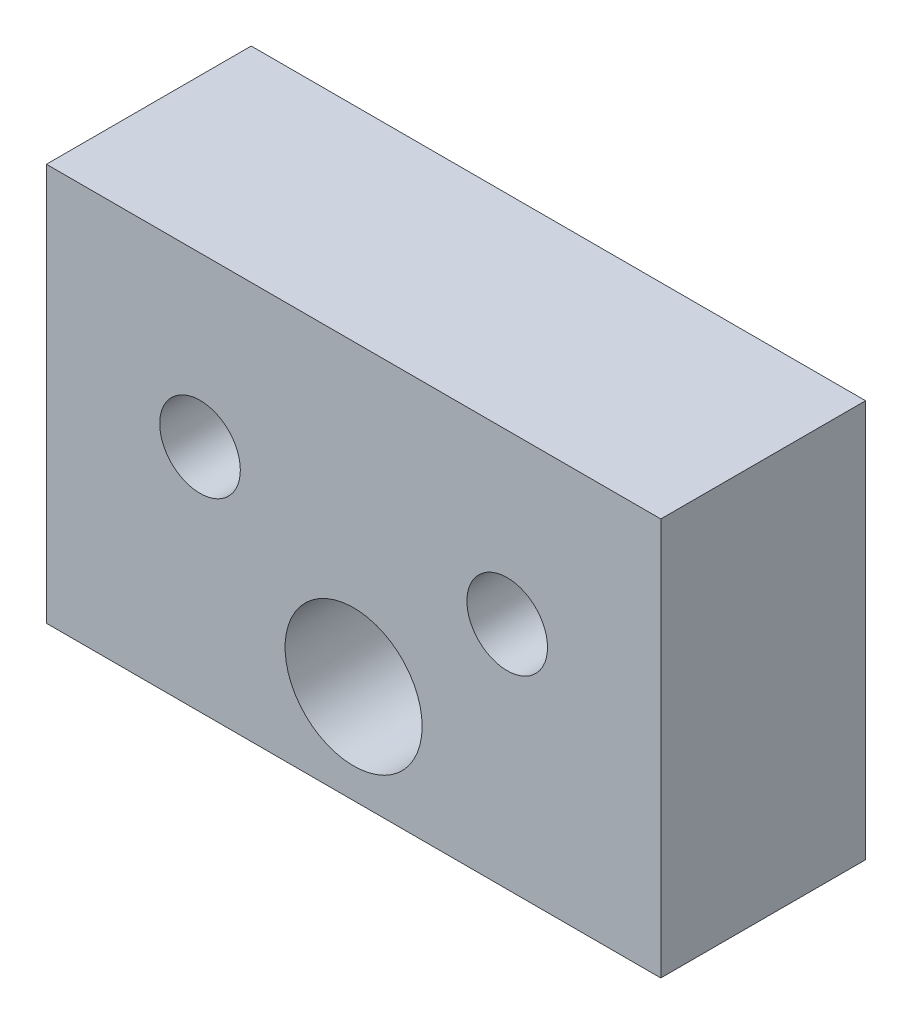
ISO-10303-21;
HEADER;
FILE_DESCRIPTION(('STEP AP214'),'2;1');
FILE_NAME('part.step','',(''),(''),'','','');
FILE_SCHEMA(('AUTOMOTIVE_DESIGN { 1 0 10303 214 1 1 1 1 }'));
ENDSEC;
DATA;
#1=APPLICATION_CONTEXT('core data for automotive mechanical design processes');
#2=APPLICATION_PROTOCOL_DEFINITION('international standard','automotive_design',2000,#1);
#3=PRODUCT_CONTEXT('',#1,'mechanical');
#4=PRODUCT('Part','Part','',(#3));
#5=PRODUCT_RELATED_PRODUCT_CATEGORY('part','',(#4));
#6=PRODUCT_DEFINITION_FORMATION('','',#4);
#7=PRODUCT_DEFINITION_CONTEXT('part definition',#1,'design');
#8=PRODUCT_DEFINITION('design','',#6,#7);
#9=PRODUCT_DEFINITION_SHAPE('','',#8);
#10=(LENGTH_UNIT() NAMED_UNIT(*) SI_UNIT(.MILLI.,.METRE.));
#11=(NAMED_UNIT(*) PLANE_ANGLE_UNIT() SI_UNIT($,.RADIAN.));
#12=(NAMED_UNIT(*) SI_UNIT($,.STERADIAN.) SOLID_ANGLE_UNIT());
#13=UNCERTAINTY_MEASURE_WITH_UNIT(LENGTH_MEASURE(1.E-05),#10,'distance_accuracy_value','');
#14=(GEOMETRIC_REPRESENTATION_CONTEXT(3) GLOBAL_UNCERTAINTY_ASSIGNED_CONTEXT((#13)) GLOBAL_UNIT_ASSIGNED_CONTEXT((#10,
#11,#12)) REPRESENTATION_CONTEXT('',''));
#15=CARTESIAN_POINT('',(0.,0.,0.));
#16=DIRECTION('',(0.,0.,1.));
#17=DIRECTION('',(1.,0.,0.));
#18=AXIS2_PLACEMENT_3D('',#15,#16,#17);
#19=CARTESIAN_POINT('',(0.,37.084,12.7));
#20=DIRECTION('',(0.,1.,0.));
#21=DIRECTION('',(0.,0.,1.));
#22=AXIS2_PLACEMENT_3D('',#19,#20,#21);
#23=PLANE('',#22);
#24=DIRECTION('',(1.,0.,0.));
#25=VECTOR('',#24,1.);
#26=CARTESIAN_POINT('',(0.,37.084,-12.7));
#27=LINE('',#26,#25);
#28=CARTESIAN_POINT('',(-38.1,37.084,-12.7));
#29=VERTEX_POINT('',#28);
#30=CARTESIAN_POINT('',(38.1,37.084,-12.7));
#31=VERTEX_POINT('',#30);
#32=EDGE_CURVE('E105',#29,#31,#27,.T.);
#33=ORIENTED_EDGE('',*,*,#32,.F.);
#34=DIRECTION('',(0.,0.,-1.));
#35=VECTOR('',#34,1.);
#36=CARTESIAN_POINT('',(-38.1,37.084,12.7));
#37=LINE('',#36,#35);
#38=CARTESIAN_POINT('',(-38.1,37.084,12.7));
#39=VERTEX_POINT('',#38);
#40=EDGE_CURVE('E11',#39,#29,#37,.T.);
#41=ORIENTED_EDGE('',*,*,#40,.F.);
#42=DIRECTION('',(1.,0.,0.));
#43=VECTOR('',#42,1.);
#44=CARTESIAN_POINT('',(0.,37.084,12.7));
#45=LINE('',#44,#43);
#46=CARTESIAN_POINT('',(38.1,37.084,12.7));
#47=VERTEX_POINT('',#46);
#48=EDGE_CURVE('E91',#39,#47,#45,.T.);
#49=ORIENTED_EDGE('',*,*,#48,.T.);
#50=DIRECTION('',(0.,0.,-1.));
#51=VECTOR('',#50,1.);
#52=CARTESIAN_POINT('',(38.1,37.084,12.7));
#53=LINE('',#52,#51);
#54=EDGE_CURVE('E73',#47,#31,#53,.T.);
#55=ORIENTED_EDGE('',*,*,#54,.T.);
#56=EDGE_LOOP('',(#33,#41,#49,#55));
#57=FACE_BOUND('',#56,.T.);
#58=ADVANCED_FACE('F34',(#57),#23,.T.);
#59=CARTESIAN_POINT('',(-38.1,0.,12.7));
#60=DIRECTION('',(1.,0.,0.));
#61=DIRECTION('',(0.,0.,-1.));
#62=AXIS2_PLACEMENT_3D('',#59,#60,#61);
#63=PLANE('',#62);
#64=DIRECTION('',(0.,-1.,0.));
#65=VECTOR('',#64,1.);
#66=CARTESIAN_POINT('',(-38.1,0.,-12.7));
#67=LINE('',#66,#65);
#68=CARTESIAN_POINT('',(-38.1,-12.224,-12.7));
#69=VERTEX_POINT('',#68);
#70=EDGE_CURVE('E96',#29,#69,#67,.T.);
#71=ORIENTED_EDGE('',*,*,#70,.T.);
#72=DIRECTION('',(0.,0.,-1.));
#73=VECTOR('',#72,1.);
#74=CARTESIAN_POINT('',(-38.1,-12.224,12.7));
#75=LINE('',#74,#73);
#76=CARTESIAN_POINT('',(-38.1,-12.224,12.7));
#77=VERTEX_POINT('',#76);
#78=EDGE_CURVE('E43',#77,#69,#75,.T.);
#79=ORIENTED_EDGE('',*,*,#78,.F.);
#80=DIRECTION('',(0.,-1.,0.));
#81=VECTOR('',#80,1.);
#82=CARTESIAN_POINT('',(-38.1,0.,12.7));
#83=LINE('',#82,#81);
#84=EDGE_CURVE('E88',#39,#77,#83,.T.);
#85=ORIENTED_EDGE('',*,*,#84,.F.);
#86=ORIENTED_EDGE('',*,*,#40,.T.);
#87=EDGE_LOOP('',(#71,#79,#85,#86));
#88=FACE_BOUND('',#87,.T.);
#89=ADVANCED_FACE('F94',(#88),#63,.F.);
#90=CARTESIAN_POINT('',(0.,-12.224,12.7));
#91=DIRECTION('',(0.,1.,0.));
#92=DIRECTION('',(0.,0.,1.));
#93=AXIS2_PLACEMENT_3D('',#90,#91,#92);
#94=PLANE('',#93);
#95=DIRECTION('',(1.,0.,0.));
#96=VECTOR('',#95,1.);
#97=CARTESIAN_POINT('',(0.,-12.224,-12.7));
#98=LINE('',#97,#96);
#99=CARTESIAN_POINT('',(38.1,-12.224,-12.7));
#100=VERTEX_POINT('',#99);
#101=EDGE_CURVE('E102',#69,#100,#98,.T.);
#102=ORIENTED_EDGE('',*,*,#101,.T.);
#103=DIRECTION('',(0.,0.,-1.));
#104=VECTOR('',#103,1.);
#105=CARTESIAN_POINT('',(38.1,-12.224,12.7));
#106=LINE('',#105,#104);
#107=CARTESIAN_POINT('',(38.1,-12.224,12.7));
#108=VERTEX_POINT('',#107);
#109=EDGE_CURVE('E87',#108,#100,#106,.T.);
#110=ORIENTED_EDGE('',*,*,#109,.F.);
#111=DIRECTION('',(1.,0.,0.));
#112=VECTOR('',#111,1.);
#113=CARTESIAN_POINT('',(0.,-12.224,12.7));
#114=LINE('',#113,#112);
#115=EDGE_CURVE('E81',#77,#108,#114,.T.);
#116=ORIENTED_EDGE('',*,*,#115,.F.);
#117=ORIENTED_EDGE('',*,*,#78,.T.);
#118=EDGE_LOOP('',(#102,#110,#116,#117));
#119=FACE_BOUND('',#118,.T.);
#120=ADVANCED_FACE('F84',(#119),#94,.F.);
#121=CARTESIAN_POINT('',(0.,0.,12.7));
#122=DIRECTION('',(0.,0.,-1.));
#123=DIRECTION('',(-1.,0.,0.));
#124=AXIS2_PLACEMENT_3D('',#121,#122,#123);
#125=CYLINDRICAL_SURFACE('',#124,8.5);
#126=CARTESIAN_POINT('',(0.,0.,12.7));
#127=DIRECTION('',(0.,0.,1.));
#128=DIRECTION('',(1.,0.,0.));
#129=AXIS2_PLACEMENT_3D('',#126,#127,#128);
#130=CIRCLE('',#129,8.5);
#131=CARTESIAN_POINT('',(8.5,0.,12.7));
#132=VERTEX_POINT('',#131);
#133=EDGE_CURVE('E118',#132,#132,#130,.T.);
#134=ORIENTED_EDGE('',*,*,#133,.T.);
#135=EDGE_LOOP('',(#134));
#136=FACE_BOUND('',#135,.T.);
#137=CARTESIAN_POINT('',(0.,0.,-12.7));
#138=DIRECTION('',(0.,0.,1.));
#139=DIRECTION('',(1.,0.,0.));
#140=AXIS2_PLACEMENT_3D('',#137,#138,#139);
#141=CIRCLE('',#140,8.5);
#142=CARTESIAN_POINT('',(8.5,0.,-12.7));
#143=VERTEX_POINT('',#142);
#144=EDGE_CURVE('E107',#143,#143,#141,.T.);
#145=ORIENTED_EDGE('',*,*,#144,.F.);
#146=EDGE_LOOP('',(#145));
#147=FACE_BOUND('',#146,.T.);
#148=ADVANCED_FACE('F138',(#136,#147),#125,.F.);
#149=CARTESIAN_POINT('',(19.05,16.256,12.7));
#150=DIRECTION('',(0.,0.,-1.));
#151=DIRECTION('',(-1.,0.,0.));
#152=AXIS2_PLACEMENT_3D('',#149,#150,#151);
#153=CYLINDRICAL_SURFACE('',#152,5.);
#154=CARTESIAN_POINT('',(19.05,16.256,12.7));
#155=DIRECTION('',(0.,0.,1.));
#156=DIRECTION('',(1.,0.,0.));
#157=AXIS2_PLACEMENT_3D('',#154,#155,#156);
#158=CIRCLE('',#157,5.);
#159=CARTESIAN_POINT('',(24.05,16.256,12.7));
#160=VERTEX_POINT('',#159);
#161=EDGE_CURVE('E121',#160,#160,#158,.T.);
#162=ORIENTED_EDGE('',*,*,#161,.T.);
#163=EDGE_LOOP('',(#162));
#164=FACE_BOUND('',#163,.T.);
#165=CARTESIAN_POINT('',(19.05,16.256,-12.7));
#166=DIRECTION('',(0.,0.,1.));
#167=DIRECTION('',(1.,0.,0.));
#168=AXIS2_PLACEMENT_3D('',#165,#166,#167);
#169=CIRCLE('',#168,5.);
#170=CARTESIAN_POINT('',(24.05,16.256,-12.7));
#171=VERTEX_POINT('',#170);
#172=EDGE_CURVE('E110',#171,#171,#169,.T.);
#173=ORIENTED_EDGE('',*,*,#172,.F.);
#174=EDGE_LOOP('',(#173));
#175=FACE_BOUND('',#174,.T.);
#176=ADVANCED_FACE('F141',(#164,#175),#153,.F.);
#177=CARTESIAN_POINT('',(-19.05,16.256,12.7));
#178=DIRECTION('',(0.,0.,-1.));
#179=DIRECTION('',(-1.,0.,0.));
#180=AXIS2_PLACEMENT_3D('',#177,#178,#179);
#181=CYLINDRICAL_SURFACE('',#180,5.);
#182=CARTESIAN_POINT('',(-19.05,16.256,12.7));
#183=DIRECTION('',(0.,0.,1.));
#184=DIRECTION('',(1.,0.,0.));
#185=AXIS2_PLACEMENT_3D('',#182,#183,#184);
#186=CIRCLE('',#185,5.);
#187=CARTESIAN_POINT('',(-14.05,16.256,12.7));
#188=VERTEX_POINT('',#187);
#189=EDGE_CURVE('E101',#188,#188,#186,.T.);
#190=ORIENTED_EDGE('',*,*,#189,.T.);
#191=EDGE_LOOP('',(#190));
#192=FACE_BOUND('',#191,.T.);
#193=CARTESIAN_POINT('',(-19.05,16.256,-12.7));
#194=DIRECTION('',(0.,0.,1.));
#195=DIRECTION('',(1.,0.,0.));
#196=AXIS2_PLACEMENT_3D('',#193,#194,#195);
#197=CIRCLE('',#196,5.);
#198=CARTESIAN_POINT('',(-14.05,16.256,-12.7));
#199=VERTEX_POINT('',#198);
#200=EDGE_CURVE('E113',#199,#199,#197,.T.);
#201=ORIENTED_EDGE('',*,*,#200,.F.);
#202=EDGE_LOOP('',(#201));
#203=FACE_BOUND('',#202,.T.);
#204=ADVANCED_FACE('F36',(#192,#203),#181,.F.);
#205=CARTESIAN_POINT('',(38.1,0.,12.7));
#206=DIRECTION('',(-1.,0.,0.));
#207=DIRECTION('',(0.,0.,1.));
#208=AXIS2_PLACEMENT_3D('',#205,#206,#207);
#209=PLANE('',#208);
#210=DIRECTION('',(0.,1.,0.));
#211=VECTOR('',#210,1.);
#212=CARTESIAN_POINT('',(38.1,0.,-12.7));
#213=LINE('',#212,#211);
#214=EDGE_CURVE('E66',#100,#31,#213,.T.);
#215=ORIENTED_EDGE('',*,*,#214,.T.);
#216=ORIENTED_EDGE('',*,*,#54,.F.);
#217=DIRECTION('',(0.,1.,0.));
#218=VECTOR('',#217,1.);
#219=CARTESIAN_POINT('',(38.1,0.,12.7));
#220=LINE('',#219,#218);
#221=EDGE_CURVE('E51',#108,#47,#220,.T.);
#222=ORIENTED_EDGE('',*,*,#221,.F.);
#223=ORIENTED_EDGE('',*,*,#109,.T.);
#224=EDGE_LOOP('',(#215,#216,#222,#223));
#225=FACE_BOUND('',#224,.T.);
#226=ADVANCED_FACE('F132',(#225),#209,.F.);
#227=CARTESIAN_POINT('',(0.,0.,12.7));
#228=DIRECTION('',(0.,0.,1.));
#229=DIRECTION('',(1.,0.,0.));
#230=AXIS2_PLACEMENT_3D('',#227,#228,#229);
#231=PLANE('',#230);
#232=ORIENTED_EDGE('',*,*,#189,.F.);
#233=EDGE_LOOP('',(#232));
#234=FACE_BOUND('',#233,.T.);
#235=ORIENTED_EDGE('',*,*,#161,.F.);
#236=EDGE_LOOP('',(#235));
#237=FACE_BOUND('',#236,.T.);
#238=ORIENTED_EDGE('',*,*,#133,.F.);
#239=EDGE_LOOP('',(#238));
#240=FACE_BOUND('',#239,.T.);
#241=ORIENTED_EDGE('',*,*,#48,.F.);
#242=ORIENTED_EDGE('',*,*,#84,.T.);
#243=ORIENTED_EDGE('',*,*,#115,.T.);
#244=ORIENTED_EDGE('',*,*,#221,.T.);
#245=EDGE_LOOP('',(#241,#242,#243,#244));
#246=FACE_BOUND('',#245,.T.);
#247=ADVANCED_FACE('F90',(#234,#237,#240,#246),#231,.T.);
#248=CARTESIAN_POINT('',(0.,0.,-12.7));
#249=DIRECTION('',(0.,0.,1.));
#250=DIRECTION('',(1.,0.,0.));
#251=AXIS2_PLACEMENT_3D('',#248,#249,#250);
#252=PLANE('',#251);
#253=ORIENTED_EDGE('',*,*,#200,.T.);
#254=EDGE_LOOP('',(#253));
#255=FACE_BOUND('',#254,.T.);
#256=ORIENTED_EDGE('',*,*,#172,.T.);
#257=EDGE_LOOP('',(#256));
#258=FACE_BOUND('',#257,.T.);
#259=ORIENTED_EDGE('',*,*,#144,.T.);
#260=EDGE_LOOP('',(#259));
#261=FACE_BOUND('',#260,.T.);
#262=ORIENTED_EDGE('',*,*,#32,.T.);
#263=ORIENTED_EDGE('',*,*,#214,.F.);
#264=ORIENTED_EDGE('',*,*,#101,.F.);
#265=ORIENTED_EDGE('',*,*,#70,.F.);
#266=EDGE_LOOP('',(#262,#263,#264,#265));
#267=FACE_BOUND('',#266,.T.);
#268=ADVANCED_FACE('F131',(#255,#258,#261,#267),#252,.F.);
#269=CLOSED_SHELL('',(#58,#89,#120,#148,#176,#204,#226,#247,#268));
#270=MANIFOLD_SOLID_BREP('B2',#269);
#271=ADVANCED_BREP_SHAPE_REPRESENTATION('',(#18,#270),#14);
#272=SHAPE_DEFINITION_REPRESENTATION(#9,#271);
ENDSEC;
END-ISO-10303-21;
